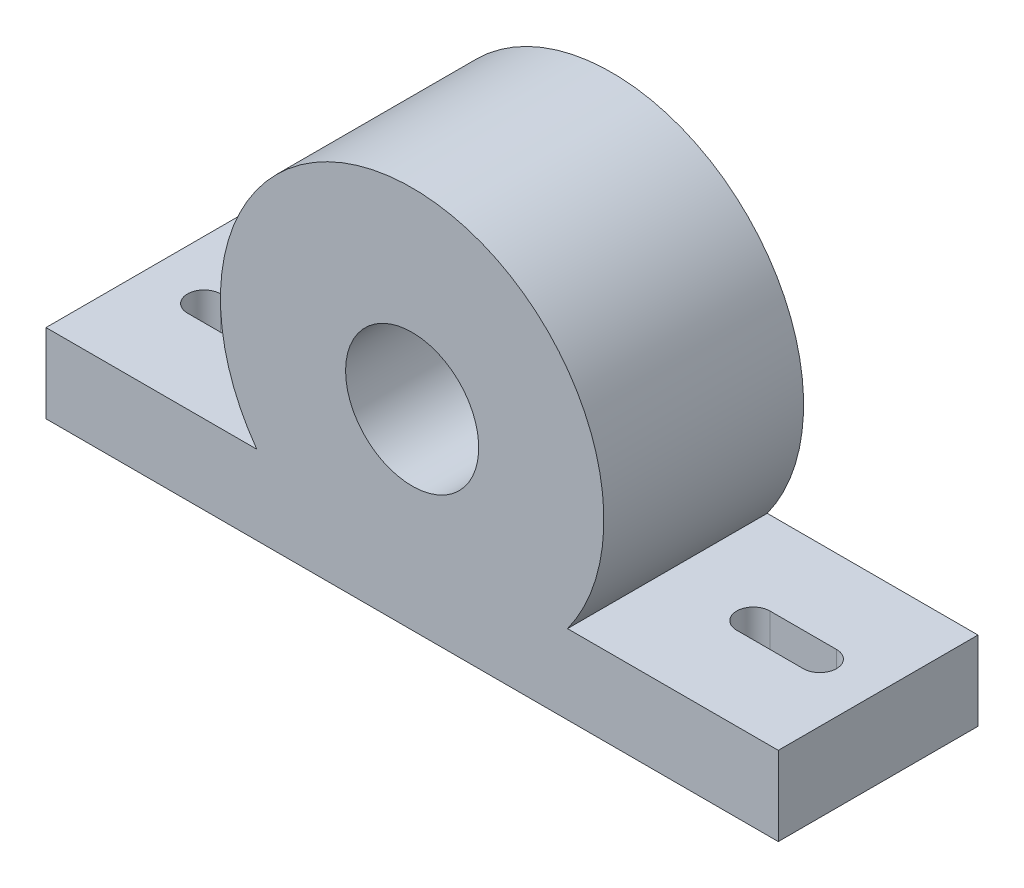
ISO-10303-21;
HEADER;
FILE_DESCRIPTION(('STEP AP214'),'2;1');
FILE_NAME('part.step','',(''),(''),'','','');
FILE_SCHEMA(('AUTOMOTIVE_DESIGN { 1 0 10303 214 1 1 1 1 }'));
ENDSEC;
DATA;
#1=APPLICATION_CONTEXT('core data for automotive mechanical design processes');
#2=APPLICATION_PROTOCOL_DEFINITION('international standard','automotive_design',2000,#1);
#3=PRODUCT_CONTEXT('',#1,'mechanical');
#4=PRODUCT('Part','Part','',(#3));
#5=PRODUCT_RELATED_PRODUCT_CATEGORY('part','',(#4));
#6=PRODUCT_DEFINITION_FORMATION('','',#4);
#7=PRODUCT_DEFINITION_CONTEXT('part definition',#1,'design');
#8=PRODUCT_DEFINITION('design','',#6,#7);
#9=PRODUCT_DEFINITION_SHAPE('','',#8);
#10=(LENGTH_UNIT() NAMED_UNIT(*) SI_UNIT(.MILLI.,.METRE.));
#11=(NAMED_UNIT(*) PLANE_ANGLE_UNIT() SI_UNIT($,.RADIAN.));
#12=(NAMED_UNIT(*) SI_UNIT($,.STERADIAN.) SOLID_ANGLE_UNIT());
#13=UNCERTAINTY_MEASURE_WITH_UNIT(LENGTH_MEASURE(1.E-05),#10,'distance_accuracy_value','');
#14=(GEOMETRIC_REPRESENTATION_CONTEXT(3) GLOBAL_UNCERTAINTY_ASSIGNED_CONTEXT((#13)) GLOBAL_UNIT_ASSIGNED_CONTEXT((#10,
#11,#12)) REPRESENTATION_CONTEXT('',''));
#15=CARTESIAN_POINT('',(0.,0.,0.));
#16=DIRECTION('',(0.,0.,1.));
#17=DIRECTION('',(1.,0.,0.));
#18=AXIS2_PLACEMENT_3D('',#15,#16,#17);
#19=CARTESIAN_POINT('',(-69.85,-36.5125,38.1));
#20=DIRECTION('',(0.,1.,0.));
#21=DIRECTION('',(0.,0.,1.));
#22=AXIS2_PLACEMENT_3D('',#19,#20,#21);
#23=PLANE('',#22);
#24=DIRECTION('',(1.,0.,0.));
#25=VECTOR('',#24,1.);
#26=CARTESIAN_POINT('',(-69.85,-36.5125,0.));
#27=LINE('',#26,#25);
#28=CARTESIAN_POINT('',(-69.85,-36.5125,0.));
#29=VERTEX_POINT('',#28);
#30=CARTESIAN_POINT('',(69.85,-36.5125,0.));
#31=VERTEX_POINT('',#30);
#32=EDGE_CURVE('E227',#29,#31,#27,.T.);
#33=ORIENTED_EDGE('',*,*,#32,.T.);
#34=DIRECTION('',(0.,0.,-1.));
#35=VECTOR('',#34,1.);
#36=CARTESIAN_POINT('',(69.85,-36.5125,38.1));
#37=LINE('',#36,#35);
#38=CARTESIAN_POINT('',(69.85,-36.5125,38.1));
#39=VERTEX_POINT('',#38);
#40=EDGE_CURVE('E45',#39,#31,#37,.T.);
#41=ORIENTED_EDGE('',*,*,#40,.F.);
#42=DIRECTION('',(1.,0.,0.));
#43=VECTOR('',#42,1.);
#44=CARTESIAN_POINT('',(-69.85,-36.5125,38.1));
#45=LINE('',#44,#43);
#46=CARTESIAN_POINT('',(-69.85,-36.5125,38.1));
#47=VERTEX_POINT('',#46);
#48=EDGE_CURVE('E213',#47,#39,#45,.T.);
#49=ORIENTED_EDGE('',*,*,#48,.F.);
#50=DIRECTION('',(0.,0.,-1.));
#51=VECTOR('',#50,1.);
#52=CARTESIAN_POINT('',(-69.85,-36.5125,38.1));
#53=LINE('',#52,#51);
#54=EDGE_CURVE('E11',#47,#29,#53,.T.);
#55=ORIENTED_EDGE('',*,*,#54,.T.);
#56=EDGE_LOOP('',(#33,#41,#49,#55));
#57=FACE_BOUND('',#56,.T.);
#58=DIRECTION('',(-1.,0.,0.));
#59=VECTOR('',#58,1.);
#60=CARTESIAN_POINT('',(-58.7375,-36.5125,15.875));
#61=LINE('',#60,#59);
#62=CARTESIAN_POINT('',(-46.0375,-36.5125,15.875));
#63=VERTEX_POINT('',#62);
#64=CARTESIAN_POINT('',(-58.7375,-36.5125,15.875));
#65=VERTEX_POINT('',#64);
#66=EDGE_CURVE('E182',#63,#65,#61,.T.);
#67=ORIENTED_EDGE('',*,*,#66,.T.);
#68=CARTESIAN_POINT('',(-58.7375,-36.5125,19.05));
#69=DIRECTION('',(0.,1.,0.));
#70=DIRECTION('',(0.,0.,1.));
#71=AXIS2_PLACEMENT_3D('',#68,#69,#70);
#72=CIRCLE('',#71,3.175);
#73=CARTESIAN_POINT('',(-58.7375,-36.5125,22.225));
#74=VERTEX_POINT('',#73);
#75=EDGE_CURVE('E172',#65,#74,#72,.T.);
#76=ORIENTED_EDGE('',*,*,#75,.T.);
#77=DIRECTION('',(1.,0.,0.));
#78=VECTOR('',#77,1.);
#79=CARTESIAN_POINT('',(-58.7375,-36.5125,22.225));
#80=LINE('',#79,#78);
#81=CARTESIAN_POINT('',(-46.0375,-36.5125,22.225));
#82=VERTEX_POINT('',#81);
#83=EDGE_CURVE('E175',#74,#82,#80,.T.);
#84=ORIENTED_EDGE('',*,*,#83,.T.);
#85=CARTESIAN_POINT('',(-46.0375,-36.5125,19.05));
#86=DIRECTION('',(0.,1.,0.));
#87=DIRECTION('',(0.,0.,1.));
#88=AXIS2_PLACEMENT_3D('',#85,#86,#87);
#89=CIRCLE('',#88,3.175);
#90=EDGE_CURVE('E179',#82,#63,#89,.T.);
#91=ORIENTED_EDGE('',*,*,#90,.T.);
#92=EDGE_LOOP('',(#67,#76,#84,#91));
#93=FACE_BOUND('',#92,.T.);
#94=CARTESIAN_POINT('',(58.7375,-36.5125,19.05));
#95=DIRECTION('',(0.,-1.,0.));
#96=DIRECTION('',(0.,0.,1.));
#97=AXIS2_PLACEMENT_3D('',#94,#95,#96);
#98=CIRCLE('',#97,3.175);
#99=CARTESIAN_POINT('',(58.7375,-36.5125,15.875));
#100=VERTEX_POINT('',#99);
#101=CARTESIAN_POINT('',(58.7375,-36.5125,22.225));
#102=VERTEX_POINT('',#101);
#103=EDGE_CURVE('E146',#100,#102,#98,.T.);
#104=ORIENTED_EDGE('',*,*,#103,.F.);
#105=DIRECTION('',(1.,0.,0.));
#106=VECTOR('',#105,1.);
#107=CARTESIAN_POINT('',(58.7375,-36.5125,15.875));
#108=LINE('',#107,#106);
#109=CARTESIAN_POINT('',(46.0375,-36.5125,15.875));
#110=VERTEX_POINT('',#109);
#111=EDGE_CURVE('E138',#110,#100,#108,.T.);
#112=ORIENTED_EDGE('',*,*,#111,.F.);
#113=CARTESIAN_POINT('',(46.0375,-36.5125,19.05));
#114=DIRECTION('',(0.,-1.,0.));
#115=DIRECTION('',(0.,0.,1.));
#116=AXIS2_PLACEMENT_3D('',#113,#114,#115);
#117=CIRCLE('',#116,3.175);
#118=CARTESIAN_POINT('',(46.0375,-36.5125,22.225));
#119=VERTEX_POINT('',#118);
#120=EDGE_CURVE('E145',#119,#110,#117,.T.);
#121=ORIENTED_EDGE('',*,*,#120,.F.);
#122=DIRECTION('',(-1.,0.,0.));
#123=VECTOR('',#122,1.);
#124=CARTESIAN_POINT('',(58.7375,-36.5125,22.225));
#125=LINE('',#124,#123);
#126=EDGE_CURVE('E150',#102,#119,#125,.T.);
#127=ORIENTED_EDGE('',*,*,#126,.F.);
#128=EDGE_LOOP('',(#104,#112,#121,#127));
#129=FACE_BOUND('',#128,.T.);
#130=ADVANCED_FACE('F37',(#57,#93,#129),#23,.F.);
#131=CARTESIAN_POINT('',(69.85,-21.43125,38.1));
#132=DIRECTION('',(0.,-1.,0.));
#133=DIRECTION('',(0.,0.,-1.));
#134=AXIS2_PLACEMENT_3D('',#131,#132,#133);
#135=PLANE('',#134);
#136=DIRECTION('',(-1.,0.,0.));
#137=VECTOR('',#136,1.);
#138=CARTESIAN_POINT('',(69.85,-21.43125,0.));
#139=LINE('',#138,#137);
#140=CARTESIAN_POINT('',(69.85,-21.43125,0.));
#141=VERTEX_POINT('',#140);
#142=CARTESIAN_POINT('',(29.639590068648,-21.43125,0.));
#143=VERTEX_POINT('',#142);
#144=EDGE_CURVE('E231',#141,#143,#139,.T.);
#145=ORIENTED_EDGE('',*,*,#144,.T.);
#146=DIRECTION('',(0.,0.,-1.));
#147=VECTOR('',#146,1.);
#148=CARTESIAN_POINT('',(29.639590068648,-21.43125,38.1));
#149=LINE('',#148,#147);
#150=CARTESIAN_POINT('',(29.639590068648,-21.43125,38.1));
#151=VERTEX_POINT('',#150);
#152=EDGE_CURVE('E241',#151,#143,#149,.T.);
#153=ORIENTED_EDGE('',*,*,#152,.F.);
#154=DIRECTION('',(-1.,0.,0.));
#155=VECTOR('',#154,1.);
#156=CARTESIAN_POINT('',(69.85,-21.43125,38.1));
#157=LINE('',#156,#155);
#158=CARTESIAN_POINT('',(69.85,-21.43125,38.1));
#159=VERTEX_POINT('',#158);
#160=EDGE_CURVE('E218',#159,#151,#157,.T.);
#161=ORIENTED_EDGE('',*,*,#160,.F.);
#162=DIRECTION('',(0.,0.,-1.));
#163=VECTOR('',#162,1.);
#164=CARTESIAN_POINT('',(69.85,-21.43125,38.1));
#165=LINE('',#164,#163);
#166=EDGE_CURVE('E244',#159,#141,#165,.T.);
#167=ORIENTED_EDGE('',*,*,#166,.T.);
#168=EDGE_LOOP('',(#145,#153,#161,#167));
#169=FACE_BOUND('',#168,.T.);
#170=CARTESIAN_POINT('',(58.7375,-21.43125,19.05));
#171=DIRECTION('',(0.,-1.,0.));
#172=DIRECTION('',(0.,0.,1.));
#173=AXIS2_PLACEMENT_3D('',#170,#171,#172);
#174=CIRCLE('',#173,3.175);
#175=CARTESIAN_POINT('',(58.7375,-21.43125,15.875));
#176=VERTEX_POINT('',#175);
#177=CARTESIAN_POINT('',(58.7375,-21.43125,22.225));
#178=VERTEX_POINT('',#177);
#179=EDGE_CURVE('E60',#176,#178,#174,.T.);
#180=ORIENTED_EDGE('',*,*,#179,.T.);
#181=DIRECTION('',(-1.,0.,0.));
#182=VECTOR('',#181,1.);
#183=CARTESIAN_POINT('',(58.7375,-21.43125,22.225));
#184=LINE('',#183,#182);
#185=CARTESIAN_POINT('',(46.0375,-21.43125,22.225));
#186=VERTEX_POINT('',#185);
#187=EDGE_CURVE('E153',#178,#186,#184,.T.);
#188=ORIENTED_EDGE('',*,*,#187,.T.);
#189=CARTESIAN_POINT('',(46.0375,-21.43125,19.05));
#190=DIRECTION('',(0.,-1.,0.));
#191=DIRECTION('',(0.,0.,1.));
#192=AXIS2_PLACEMENT_3D('',#189,#190,#191);
#193=CIRCLE('',#192,3.175);
#194=CARTESIAN_POINT('',(46.0375,-21.43125,15.875));
#195=VERTEX_POINT('',#194);
#196=EDGE_CURVE('E156',#186,#195,#193,.T.);
#197=ORIENTED_EDGE('',*,*,#196,.T.);
#198=DIRECTION('',(1.,0.,0.));
#199=VECTOR('',#198,1.);
#200=CARTESIAN_POINT('',(58.7375,-21.43125,15.875));
#201=LINE('',#200,#199);
#202=EDGE_CURVE('E162',#195,#176,#201,.T.);
#203=ORIENTED_EDGE('',*,*,#202,.T.);
#204=EDGE_LOOP('',(#180,#188,#197,#203));
#205=FACE_BOUND('',#204,.T.);
#206=ADVANCED_FACE('F263',(#169,#205),#135,.F.);
#207=CARTESIAN_POINT('',(0.,0.,38.1));
#208=DIRECTION('',(0.,0.,1.));
#209=DIRECTION('',(1.,0.,0.));
#210=AXIS2_PLACEMENT_3D('',#207,#208,#209);
#211=PLANE('',#210);
#212=DIRECTION('',(0.,-1.,0.));
#213=VECTOR('',#212,1.);
#214=CARTESIAN_POINT('',(-69.85,-36.5125,38.1));
#215=LINE('',#214,#213);
#216=CARTESIAN_POINT('',(-69.85,-21.43125,38.1));
#217=VERTEX_POINT('',#216);
#218=EDGE_CURVE('E210',#217,#47,#215,.T.);
#219=ORIENTED_EDGE('',*,*,#218,.T.);
#220=ORIENTED_EDGE('',*,*,#48,.T.);
#221=DIRECTION('',(0.,1.,0.));
#222=VECTOR('',#221,1.);
#223=CARTESIAN_POINT('',(69.85,-36.5125,38.1));
#224=LINE('',#223,#222);
#225=EDGE_CURVE('E216',#39,#159,#224,.T.);
#226=ORIENTED_EDGE('',*,*,#225,.T.);
#227=ORIENTED_EDGE('',*,*,#160,.T.);
#228=CARTESIAN_POINT('',(0.,0.,38.1));
#229=DIRECTION('',(0.,0.,1.));
#230=DIRECTION('',(1.,0.,0.));
#231=AXIS2_PLACEMENT_3D('',#228,#229,#230);
#232=CIRCLE('',#231,36.576);
#233=CARTESIAN_POINT('',(-29.639590068648,-21.43125,38.1));
#234=VERTEX_POINT('',#233);
#235=EDGE_CURVE('E220',#151,#234,#232,.T.);
#236=ORIENTED_EDGE('',*,*,#235,.T.);
#237=DIRECTION('',(-1.,0.,0.));
#238=VECTOR('',#237,1.);
#239=CARTESIAN_POINT('',(-69.85,-21.43125,38.1));
#240=LINE('',#239,#238);
#241=EDGE_CURVE('E222',#234,#217,#240,.T.);
#242=ORIENTED_EDGE('',*,*,#241,.T.);
#243=EDGE_LOOP('',(#219,#220,#226,#227,#236,#242));
#244=FACE_BOUND('',#243,.T.);
#245=CARTESIAN_POINT('',(0.,0.,38.1));
#246=DIRECTION('',(0.,0.,1.));
#247=DIRECTION('',(1.,0.,0.));
#248=AXIS2_PLACEMENT_3D('',#245,#246,#247);
#249=CIRCLE('',#248,12.7);
#250=CARTESIAN_POINT('',(-12.7,0.,38.1));
#251=VERTEX_POINT('',#250);
#252=EDGE_CURVE('E204',#251,#251,#249,.T.);
#253=ORIENTED_EDGE('',*,*,#252,.F.);
#254=EDGE_LOOP('',(#253));
#255=FACE_BOUND('',#254,.T.);
#256=ADVANCED_FACE('F272',(#244,#255),#211,.T.);
#257=CARTESIAN_POINT('',(0.,0.,0.));
#258=DIRECTION('',(0.,0.,1.));
#259=DIRECTION('',(1.,0.,0.));
#260=AXIS2_PLACEMENT_3D('',#257,#258,#259);
#261=PLANE('',#260);
#262=DIRECTION('',(0.,-1.,0.));
#263=VECTOR('',#262,1.);
#264=CARTESIAN_POINT('',(-69.85,-36.5125,0.));
#265=LINE('',#264,#263);
#266=CARTESIAN_POINT('',(-69.85,-21.43125,0.));
#267=VERTEX_POINT('',#266);
#268=EDGE_CURVE('E207',#267,#29,#265,.T.);
#269=ORIENTED_EDGE('',*,*,#268,.F.);
#270=DIRECTION('',(-1.,0.,0.));
#271=VECTOR('',#270,1.);
#272=CARTESIAN_POINT('',(-69.85,-21.43125,0.));
#273=LINE('',#272,#271);
#274=CARTESIAN_POINT('',(-29.639590068648,-21.43125,0.));
#275=VERTEX_POINT('',#274);
#276=EDGE_CURVE('E214',#275,#267,#273,.T.);
#277=ORIENTED_EDGE('',*,*,#276,.F.);
#278=CARTESIAN_POINT('',(0.,0.,0.));
#279=DIRECTION('',(0.,0.,1.));
#280=DIRECTION('',(1.,0.,0.));
#281=AXIS2_PLACEMENT_3D('',#278,#279,#280);
#282=CIRCLE('',#281,36.576);
#283=EDGE_CURVE('E233',#143,#275,#282,.T.);
#284=ORIENTED_EDGE('',*,*,#283,.F.);
#285=ORIENTED_EDGE('',*,*,#144,.F.);
#286=DIRECTION('',(0.,1.,0.));
#287=VECTOR('',#286,1.);
#288=CARTESIAN_POINT('',(69.85,-36.5125,0.));
#289=LINE('',#288,#287);
#290=EDGE_CURVE('E229',#31,#141,#289,.T.);
#291=ORIENTED_EDGE('',*,*,#290,.F.);
#292=ORIENTED_EDGE('',*,*,#32,.F.);
#293=EDGE_LOOP('',(#269,#277,#284,#285,#291,#292));
#294=FACE_BOUND('',#293,.T.);
#295=CARTESIAN_POINT('',(0.,0.,0.));
#296=DIRECTION('',(0.,0.,1.));
#297=DIRECTION('',(1.,0.,0.));
#298=AXIS2_PLACEMENT_3D('',#295,#296,#297);
#299=CIRCLE('',#298,12.7);
#300=CARTESIAN_POINT('',(-12.7,0.,0.));
#301=VERTEX_POINT('',#300);
#302=EDGE_CURVE('E197',#301,#301,#299,.T.);
#303=ORIENTED_EDGE('',*,*,#302,.T.);
#304=EDGE_LOOP('',(#303));
#305=FACE_BOUND('',#304,.T.);
#306=ADVANCED_FACE('F257',(#294,#305),#261,.F.);
#307=CARTESIAN_POINT('',(-69.85,-36.5125,38.1));
#308=DIRECTION('',(1.,0.,0.));
#309=DIRECTION('',(0.,0.,-1.));
#310=AXIS2_PLACEMENT_3D('',#307,#308,#309);
#311=PLANE('',#310);
#312=ORIENTED_EDGE('',*,*,#268,.T.);
#313=ORIENTED_EDGE('',*,*,#54,.F.);
#314=ORIENTED_EDGE('',*,*,#218,.F.);
#315=DIRECTION('',(0.,0.,-1.));
#316=VECTOR('',#315,1.);
#317=CARTESIAN_POINT('',(-69.85,-21.43125,38.1));
#318=LINE('',#317,#316);
#319=EDGE_CURVE('E224',#217,#267,#318,.T.);
#320=ORIENTED_EDGE('',*,*,#319,.T.);
#321=EDGE_LOOP('',(#312,#313,#314,#320));
#322=FACE_BOUND('',#321,.T.);
#323=ADVANCED_FACE('F39',(#322),#311,.F.);
#324=CARTESIAN_POINT('',(69.85,-36.5125,38.1));
#325=DIRECTION('',(-1.,0.,0.));
#326=DIRECTION('',(0.,0.,1.));
#327=AXIS2_PLACEMENT_3D('',#324,#325,#326);
#328=PLANE('',#327);
#329=ORIENTED_EDGE('',*,*,#290,.T.);
#330=ORIENTED_EDGE('',*,*,#166,.F.);
#331=ORIENTED_EDGE('',*,*,#225,.F.);
#332=ORIENTED_EDGE('',*,*,#40,.T.);
#333=EDGE_LOOP('',(#329,#330,#331,#332));
#334=FACE_BOUND('',#333,.T.);
#335=ADVANCED_FACE('F251',(#334),#328,.F.);
#336=CARTESIAN_POINT('',(0.,0.,38.1));
#337=DIRECTION('',(0.,0.,-1.));
#338=DIRECTION('',(-1.,0.,0.));
#339=AXIS2_PLACEMENT_3D('',#336,#337,#338);
#340=CYLINDRICAL_SURFACE('',#339,36.576);
#341=ORIENTED_EDGE('',*,*,#283,.T.);
#342=DIRECTION('',(0.,0.,-1.));
#343=VECTOR('',#342,1.);
#344=CARTESIAN_POINT('',(-29.639590068648,-21.43125,38.1));
#345=LINE('',#344,#343);
#346=EDGE_CURVE('E238',#234,#275,#345,.T.);
#347=ORIENTED_EDGE('',*,*,#346,.F.);
#348=ORIENTED_EDGE('',*,*,#235,.F.);
#349=ORIENTED_EDGE('',*,*,#152,.T.);
#350=EDGE_LOOP('',(#341,#347,#348,#349));
#351=FACE_BOUND('',#350,.T.);
#352=ADVANCED_FACE('F268',(#351),#340,.T.);
#353=CARTESIAN_POINT('',(-69.85,-21.43125,38.1));
#354=DIRECTION('',(0.,-1.,0.));
#355=DIRECTION('',(0.,0.,-1.));
#356=AXIS2_PLACEMENT_3D('',#353,#354,#355);
#357=PLANE('',#356);
#358=DIRECTION('',(1.,0.,0.));
#359=VECTOR('',#358,1.);
#360=CARTESIAN_POINT('',(-58.7375,-21.43125,22.225));
#361=LINE('',#360,#359);
#362=CARTESIAN_POINT('',(-58.7375,-21.43125,22.225));
#363=VERTEX_POINT('',#362);
#364=CARTESIAN_POINT('',(-46.0375,-21.43125,22.225));
#365=VERTEX_POINT('',#364);
#366=EDGE_CURVE('E187',#363,#365,#361,.T.);
#367=ORIENTED_EDGE('',*,*,#366,.F.);
#368=CARTESIAN_POINT('',(-58.7375,-21.43125,19.05));
#369=DIRECTION('',(0.,1.,0.));
#370=DIRECTION('',(0.,0.,1.));
#371=AXIS2_PLACEMENT_3D('',#368,#369,#370);
#372=CIRCLE('',#371,3.175);
#373=CARTESIAN_POINT('',(-58.7375,-21.43125,15.875));
#374=VERTEX_POINT('',#373);
#375=EDGE_CURVE('E168',#374,#363,#372,.T.);
#376=ORIENTED_EDGE('',*,*,#375,.F.);
#377=DIRECTION('',(-1.,0.,0.));
#378=VECTOR('',#377,1.);
#379=CARTESIAN_POINT('',(-58.7375,-21.43125,15.875));
#380=LINE('',#379,#378);
#381=CARTESIAN_POINT('',(-46.0375,-21.43125,15.875));
#382=VERTEX_POINT('',#381);
#383=EDGE_CURVE('E176',#382,#374,#380,.T.);
#384=ORIENTED_EDGE('',*,*,#383,.F.);
#385=CARTESIAN_POINT('',(-46.0375,-21.43125,19.05));
#386=DIRECTION('',(0.,1.,0.));
#387=DIRECTION('',(0.,0.,1.));
#388=AXIS2_PLACEMENT_3D('',#385,#386,#387);
#389=CIRCLE('',#388,3.175);
#390=EDGE_CURVE('E190',#365,#382,#389,.T.);
#391=ORIENTED_EDGE('',*,*,#390,.F.);
#392=EDGE_LOOP('',(#367,#376,#384,#391));
#393=FACE_BOUND('',#392,.T.);
#394=ORIENTED_EDGE('',*,*,#276,.T.);
#395=ORIENTED_EDGE('',*,*,#319,.F.);
#396=ORIENTED_EDGE('',*,*,#241,.F.);
#397=ORIENTED_EDGE('',*,*,#346,.T.);
#398=EDGE_LOOP('',(#394,#395,#396,#397));
#399=FACE_BOUND('',#398,.T.);
#400=ADVANCED_FACE('F280',(#393,#399),#357,.F.);
#401=CARTESIAN_POINT('',(0.,0.,38.1));
#402=DIRECTION('',(0.,0.,-1.));
#403=DIRECTION('',(-1.,0.,0.));
#404=AXIS2_PLACEMENT_3D('',#401,#402,#403);
#405=CYLINDRICAL_SURFACE('',#404,12.7);
#406=CARTESIAN_POINT('',(-12.7,0.,38.1));
#407=CARTESIAN_POINT('',(-12.7,0.,37.703125));
#408=CARTESIAN_POINT('',(-12.7,0.,37.30625));
#409=CARTESIAN_POINT('',(-12.7,0.,36.5125));
#410=CARTESIAN_POINT('',(-12.7,0.,36.115625));
#411=CARTESIAN_POINT('',(-12.7,0.,35.321875));
#412=CARTESIAN_POINT('',(-12.7,0.,34.925));
#413=CARTESIAN_POINT('',(-12.7,0.,34.13125));
#414=CARTESIAN_POINT('',(-12.7,0.,33.734375));
#415=CARTESIAN_POINT('',(-12.7,0.,32.940625));
#416=CARTESIAN_POINT('',(-12.7,0.,32.54375));
#417=CARTESIAN_POINT('',(-12.7,0.,31.75));
#418=CARTESIAN_POINT('',(-12.7,0.,31.353125));
#419=CARTESIAN_POINT('',(-12.7,0.,30.559375));
#420=CARTESIAN_POINT('',(-12.7,0.,30.1625));
#421=CARTESIAN_POINT('',(-12.7,0.,29.36875));
#422=CARTESIAN_POINT('',(-12.7,0.,28.971875));
#423=CARTESIAN_POINT('',(-12.7,0.,28.178125));
#424=CARTESIAN_POINT('',(-12.7,0.,27.78125));
#425=CARTESIAN_POINT('',(-12.7,0.,26.9875));
#426=CARTESIAN_POINT('',(-12.7,0.,26.590625));
#427=CARTESIAN_POINT('',(-12.7,0.,25.796875));
#428=CARTESIAN_POINT('',(-12.7,0.,25.4));
#429=CARTESIAN_POINT('',(-12.7,0.,24.60625));
#430=CARTESIAN_POINT('',(-12.7,0.,24.209375));
#431=CARTESIAN_POINT('',(-12.7,0.,23.415625));
#432=CARTESIAN_POINT('',(-12.7,0.,23.01875));
#433=CARTESIAN_POINT('',(-12.7,0.,22.225));
#434=CARTESIAN_POINT('',(-12.7,0.,21.828125));
#435=CARTESIAN_POINT('',(-12.7,0.,21.034375));
#436=CARTESIAN_POINT('',(-12.7,0.,20.6375));
#437=CARTESIAN_POINT('',(-12.7,0.,19.84375));
#438=CARTESIAN_POINT('',(-12.7,0.,19.446875));
#439=CARTESIAN_POINT('',(-12.7,0.,18.653125));
#440=CARTESIAN_POINT('',(-12.7,0.,18.25625));
#441=CARTESIAN_POINT('',(-12.7,0.,17.4625));
#442=CARTESIAN_POINT('',(-12.7,0.,17.065625));
#443=CARTESIAN_POINT('',(-12.7,0.,16.271875));
#444=CARTESIAN_POINT('',(-12.7,0.,15.875));
#445=CARTESIAN_POINT('',(-12.7,0.,15.08125));
#446=CARTESIAN_POINT('',(-12.7,0.,14.684375));
#447=CARTESIAN_POINT('',(-12.7,0.,13.890625));
#448=CARTESIAN_POINT('',(-12.7,0.,13.49375));
#449=CARTESIAN_POINT('',(-12.7,0.,12.7));
#450=CARTESIAN_POINT('',(-12.7,0.,12.303125));
#451=CARTESIAN_POINT('',(-12.7,0.,11.509375));
#452=CARTESIAN_POINT('',(-12.7,0.,11.1125));
#453=CARTESIAN_POINT('',(-12.7,0.,10.31875));
#454=CARTESIAN_POINT('',(-12.7,0.,9.92187499999999));
#455=CARTESIAN_POINT('',(-12.7,0.,9.128125));
#456=CARTESIAN_POINT('',(-12.7,0.,8.73124999999999));
#457=CARTESIAN_POINT('',(-12.7,0.,7.93749999999999));
#458=CARTESIAN_POINT('',(-12.7,0.,7.54062499999999));
#459=CARTESIAN_POINT('',(-12.7,0.,6.746875));
#460=CARTESIAN_POINT('',(-12.7,0.,6.35));
#461=CARTESIAN_POINT('',(-12.7,0.,5.55625));
#462=CARTESIAN_POINT('',(-12.7,0.,5.159375));
#463=CARTESIAN_POINT('',(-12.7,0.,4.365625));
#464=CARTESIAN_POINT('',(-12.7,0.,3.96875));
#465=CARTESIAN_POINT('',(-12.7,0.,3.175));
#466=CARTESIAN_POINT('',(-12.7,0.,2.778125));
#467=CARTESIAN_POINT('',(-12.7,0.,1.984375));
#468=CARTESIAN_POINT('',(-12.7,0.,1.5875));
#469=CARTESIAN_POINT('',(-12.7,0.,0.79375));
#470=CARTESIAN_POINT('',(-12.7,0.,0.396875));
#471=CARTESIAN_POINT('',(-12.7,0.,0.));
#472=B_SPLINE_CURVE_WITH_KNOTS('',3,(#406,#407,#408,#409,#410,#411,#412,#413,#414,#415,#416,
#417,#418,#419,#420,#421,#422,#423,#424,#425,#426,#427,#428,#429,#430,#431,#432,#433,#434,#435,
#436,#437,#438,#439,#440,#441,#442,#443,#444,#445,#446,#447,#448,#449,#450,#451,#452,#453,#454,
#455,#456,#457,#458,#459,#460,#461,#462,#463,#464,#465,#466,#467,#468,#469,#470,#471),
.UNSPECIFIED.,.F.,.F.,(4,2,2,2,2,2,2,2,2,2,2,2,2,2,2,2,2,2,2,2,2,2,2,2,2,2,2,2,2,2,2,2,4),(0.,
1.190625,2.38125,3.571875,4.7625,5.953125,7.14375,8.334375,9.52500000000001,10.715625,11.90625,
13.096875,14.2875,15.478125,16.66875,17.859375,19.05,20.240625,21.43125,22.621875,23.8125,
25.003125,26.19375,27.384375,28.575,29.765625,30.95625,32.146875,33.3375,34.528125,35.71875,
36.909375,38.1),.UNSPECIFIED.);
#473=EDGE_CURVE('BSEAM282',#251,#301,#472,.T.);
#474=ORIENTED_EDGE('',*,*,#252,.T.);
#475=ORIENTED_EDGE('',*,*,#302,.F.);
#476=ORIENTED_EDGE('',*,*,#473,.T.);
#477=ORIENTED_EDGE('',*,*,#473,.F.);
#478=EDGE_LOOP('',(#474,#476,#475,#477));
#479=FACE_BOUND('',#478,.T.);
#480=ADVANCED_FACE('F282',(#479),#405,.F.);
#481=CARTESIAN_POINT('',(-58.7375,-36.5125,19.05));
#482=DIRECTION('',(0.,1.,0.));
#483=DIRECTION('',(0.,0.,1.));
#484=AXIS2_PLACEMENT_3D('',#481,#482,#483);
#485=CYLINDRICAL_SURFACE('',#484,3.175);
#486=ORIENTED_EDGE('',*,*,#375,.T.);
#487=DIRECTION('',(0.,1.,0.));
#488=VECTOR('',#487,1.);
#489=CARTESIAN_POINT('',(-58.7375,-36.5125,22.225));
#490=LINE('',#489,#488);
#491=EDGE_CURVE('E185',#74,#363,#490,.T.);
#492=ORIENTED_EDGE('',*,*,#491,.F.);
#493=ORIENTED_EDGE('',*,*,#75,.F.);
#494=DIRECTION('',(0.,1.,0.));
#495=VECTOR('',#494,1.);
#496=CARTESIAN_POINT('',(-58.7375,-36.5125,15.875));
#497=LINE('',#496,#495);
#498=EDGE_CURVE('E195',#65,#374,#497,.T.);
#499=ORIENTED_EDGE('',*,*,#498,.T.);
#500=EDGE_LOOP('',(#486,#492,#493,#499));
#501=FACE_BOUND('',#500,.T.);
#502=ADVANCED_FACE('F289',(#501),#485,.F.);
#503=CARTESIAN_POINT('',(-58.7375,-36.5125,15.875));
#504=DIRECTION('',(0.,0.,-1.));
#505=DIRECTION('',(-1.,0.,0.));
#506=AXIS2_PLACEMENT_3D('',#503,#504,#505);
#507=PLANE('',#506);
#508=ORIENTED_EDGE('',*,*,#383,.T.);
#509=ORIENTED_EDGE('',*,*,#498,.F.);
#510=ORIENTED_EDGE('',*,*,#66,.F.);
#511=DIRECTION('',(0.,1.,0.));
#512=VECTOR('',#511,1.);
#513=CARTESIAN_POINT('',(-46.0375,-36.5125,15.875));
#514=LINE('',#513,#512);
#515=EDGE_CURVE('E198',#63,#382,#514,.T.);
#516=ORIENTED_EDGE('',*,*,#515,.T.);
#517=EDGE_LOOP('',(#508,#509,#510,#516));
#518=FACE_BOUND('',#517,.T.);
#519=ADVANCED_FACE('F315',(#518),#507,.F.);
#520=CARTESIAN_POINT('',(-46.0375,-36.5125,19.05));
#521=DIRECTION('',(0.,1.,0.));
#522=DIRECTION('',(0.,0.,1.));
#523=AXIS2_PLACEMENT_3D('',#520,#521,#522);
#524=CYLINDRICAL_SURFACE('',#523,3.175);
#525=ORIENTED_EDGE('',*,*,#390,.T.);
#526=ORIENTED_EDGE('',*,*,#515,.F.);
#527=ORIENTED_EDGE('',*,*,#90,.F.);
#528=DIRECTION('',(0.,1.,0.));
#529=VECTOR('',#528,1.);
#530=CARTESIAN_POINT('',(-46.0375,-36.5125,22.225));
#531=LINE('',#530,#529);
#532=EDGE_CURVE('E200',#82,#365,#531,.T.);
#533=ORIENTED_EDGE('',*,*,#532,.T.);
#534=EDGE_LOOP('',(#525,#526,#527,#533));
#535=FACE_BOUND('',#534,.T.);
#536=ADVANCED_FACE('F320',(#535),#524,.F.);
#537=CARTESIAN_POINT('',(-58.7375,-36.5125,22.225));
#538=DIRECTION('',(0.,0.,1.));
#539=DIRECTION('',(1.,0.,0.));
#540=AXIS2_PLACEMENT_3D('',#537,#538,#539);
#541=PLANE('',#540);
#542=ORIENTED_EDGE('',*,*,#366,.T.);
#543=ORIENTED_EDGE('',*,*,#532,.F.);
#544=ORIENTED_EDGE('',*,*,#83,.F.);
#545=ORIENTED_EDGE('',*,*,#491,.T.);
#546=EDGE_LOOP('',(#542,#543,#544,#545));
#547=FACE_BOUND('',#546,.T.);
#548=ADVANCED_FACE('F317',(#547),#541,.F.);
#549=CARTESIAN_POINT('',(58.7375,-36.5125,19.05));
#550=DIRECTION('',(0.,1.,0.));
#551=DIRECTION('',(0.,0.,1.));
#552=AXIS2_PLACEMENT_3D('',#549,#550,#551);
#553=CYLINDRICAL_SURFACE('',#552,3.175);
#554=ORIENTED_EDGE('',*,*,#179,.F.);
#555=DIRECTION('',(0.,1.,0.));
#556=VECTOR('',#555,1.);
#557=CARTESIAN_POINT('',(58.7375,-36.5125,15.875));
#558=LINE('',#557,#556);
#559=EDGE_CURVE('E140',#100,#176,#558,.T.);
#560=ORIENTED_EDGE('',*,*,#559,.F.);
#561=ORIENTED_EDGE('',*,*,#103,.T.);
#562=DIRECTION('',(0.,1.,0.));
#563=VECTOR('',#562,1.);
#564=CARTESIAN_POINT('',(58.7375,-36.5125,22.225));
#565=LINE('',#564,#563);
#566=EDGE_CURVE('E166',#102,#178,#565,.T.);
#567=ORIENTED_EDGE('',*,*,#566,.T.);
#568=EDGE_LOOP('',(#554,#560,#561,#567));
#569=FACE_BOUND('',#568,.T.);
#570=ADVANCED_FACE('F148',(#569),#553,.F.);
#571=CARTESIAN_POINT('',(58.7375,-36.5125,22.225));
#572=DIRECTION('',(0.,0.,-1.));
#573=DIRECTION('',(-1.,0.,0.));
#574=AXIS2_PLACEMENT_3D('',#571,#572,#573);
#575=PLANE('',#574);
#576=ORIENTED_EDGE('',*,*,#187,.F.);
#577=ORIENTED_EDGE('',*,*,#566,.F.);
#578=ORIENTED_EDGE('',*,*,#126,.T.);
#579=DIRECTION('',(0.,1.,0.));
#580=VECTOR('',#579,1.);
#581=CARTESIAN_POINT('',(46.0375,-36.5125,22.225));
#582=LINE('',#581,#580);
#583=EDGE_CURVE('E169',#119,#186,#582,.T.);
#584=ORIENTED_EDGE('',*,*,#583,.T.);
#585=EDGE_LOOP('',(#576,#577,#578,#584));
#586=FACE_BOUND('',#585,.T.);
#587=ADVANCED_FACE('F330',(#586),#575,.T.);
#588=CARTESIAN_POINT('',(46.0375,-36.5125,19.05));
#589=DIRECTION('',(0.,1.,0.));
#590=DIRECTION('',(0.,0.,1.));
#591=AXIS2_PLACEMENT_3D('',#588,#589,#590);
#592=CYLINDRICAL_SURFACE('',#591,3.175);
#593=ORIENTED_EDGE('',*,*,#196,.F.);
#594=ORIENTED_EDGE('',*,*,#583,.F.);
#595=ORIENTED_EDGE('',*,*,#120,.T.);
#596=DIRECTION('',(0.,1.,0.));
#597=VECTOR('',#596,1.);
#598=CARTESIAN_POINT('',(46.0375,-36.5125,15.875));
#599=LINE('',#598,#597);
#600=EDGE_CURVE('E52',#110,#195,#599,.T.);
#601=ORIENTED_EDGE('',*,*,#600,.T.);
#602=EDGE_LOOP('',(#593,#594,#595,#601));
#603=FACE_BOUND('',#602,.T.);
#604=ADVANCED_FACE('F333',(#603),#592,.F.);
#605=CARTESIAN_POINT('',(58.7375,-36.5125,15.875));
#606=DIRECTION('',(0.,0.,1.));
#607=DIRECTION('',(1.,0.,0.));
#608=AXIS2_PLACEMENT_3D('',#605,#606,#607);
#609=PLANE('',#608);
#610=ORIENTED_EDGE('',*,*,#202,.F.);
#611=ORIENTED_EDGE('',*,*,#600,.F.);
#612=ORIENTED_EDGE('',*,*,#111,.T.);
#613=ORIENTED_EDGE('',*,*,#559,.T.);
#614=EDGE_LOOP('',(#610,#611,#612,#613));
#615=FACE_BOUND('',#614,.T.);
#616=ADVANCED_FACE('F139',(#615),#609,.T.);
#617=CLOSED_SHELL('',(#130,#206,#256,#306,#323,#335,#352,#400,#480,#502,#519,#536,#548,#570,
#587,#604,#616));
#618=MANIFOLD_SOLID_BREP('B2',#617);
#619=ADVANCED_BREP_SHAPE_REPRESENTATION('',(#18,#618),#14);
#620=SHAPE_DEFINITION_REPRESENTATION(#9,#619);
ENDSEC;
END-ISO-10303-21;
